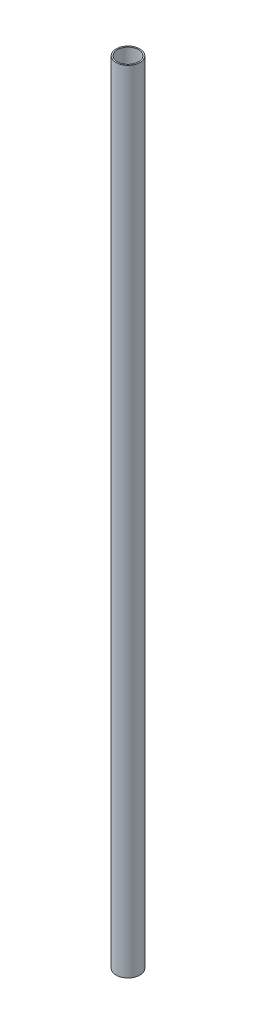
ISO-10303-21;
HEADER;
FILE_DESCRIPTION(('STEP AP214'),'2;1');
FILE_NAME('part.step','',(''),(''),'','','');
FILE_SCHEMA(('AUTOMOTIVE_DESIGN { 1 0 10303 214 1 1 1 1 }'));
ENDSEC;
DATA;
#1=APPLICATION_CONTEXT('core data for automotive mechanical design processes');
#2=APPLICATION_PROTOCOL_DEFINITION('international standard','automotive_design',2000,#1);
#3=PRODUCT_CONTEXT('',#1,'mechanical');
#4=PRODUCT('Part','Part','',(#3));
#5=PRODUCT_RELATED_PRODUCT_CATEGORY('part','',(#4));
#6=PRODUCT_DEFINITION_FORMATION('','',#4);
#7=PRODUCT_DEFINITION_CONTEXT('part definition',#1,'design');
#8=PRODUCT_DEFINITION('design','',#6,#7);
#9=PRODUCT_DEFINITION_SHAPE('','',#8);
#10=(LENGTH_UNIT() NAMED_UNIT(*) SI_UNIT(.MILLI.,.METRE.));
#11=(NAMED_UNIT(*) PLANE_ANGLE_UNIT() SI_UNIT($,.RADIAN.));
#12=(NAMED_UNIT(*) SI_UNIT($,.STERADIAN.) SOLID_ANGLE_UNIT());
#13=UNCERTAINTY_MEASURE_WITH_UNIT(LENGTH_MEASURE(1.E-05),#10,'distance_accuracy_value','');
#14=(GEOMETRIC_REPRESENTATION_CONTEXT(3) GLOBAL_UNCERTAINTY_ASSIGNED_CONTEXT((#13)) GLOBAL_UNIT_ASSIGNED_CONTEXT((#10,
#11,#12)) REPRESENTATION_CONTEXT('',''));
#15=CARTESIAN_POINT('',(0.,0.,0.));
#16=DIRECTION('',(0.,0.,1.));
#17=DIRECTION('',(1.,0.,0.));
#18=AXIS2_PLACEMENT_3D('',#15,#16,#17);
#19=CARTESIAN_POINT('',(0.,527.05,0.));
#20=DIRECTION('',(0.,1.,0.));
#21=DIRECTION('',(0.,0.,1.));
#22=AXIS2_PLACEMENT_3D('',#19,#20,#21);
#23=PLANE('',#22);
#24=CARTESIAN_POINT('',(0.,527.05,0.));
#25=DIRECTION('',(0.,1.,0.));
#26=DIRECTION('',(0.,0.,1.));
#27=AXIS2_PLACEMENT_3D('',#24,#25,#26);
#28=CIRCLE('',#27,7.9375);
#29=CARTESIAN_POINT('',(0.,527.05,7.9375));
#30=VERTEX_POINT('',#29);
#31=EDGE_CURVE('E10',#30,#30,#28,.T.);
#32=ORIENTED_EDGE('',*,*,#31,.T.);
#33=EDGE_LOOP('',(#32));
#34=FACE_BOUND('',#33,.T.);
#35=CARTESIAN_POINT('',(0.,527.05,0.));
#36=DIRECTION('',(0.,1.,0.));
#37=DIRECTION('',(0.,0.,1.));
#38=AXIS2_PLACEMENT_3D('',#35,#36,#37);
#39=CIRCLE('',#38,7.0485);
#40=CARTESIAN_POINT('',(0.,527.05,7.0485));
#41=VERTEX_POINT('',#40);
#42=EDGE_CURVE('E48',#41,#41,#39,.T.);
#43=ORIENTED_EDGE('',*,*,#42,.F.);
#44=EDGE_LOOP('',(#43));
#45=FACE_BOUND('',#44,.T.);
#46=ADVANCED_FACE('F37',(#34,#45),#23,.T.);
#47=CARTESIAN_POINT('',(0.,0.,0.));
#48=DIRECTION('',(0.,1.,0.));
#49=DIRECTION('',(0.,0.,1.));
#50=AXIS2_PLACEMENT_3D('',#47,#48,#49);
#51=PLANE('',#50);
#52=CARTESIAN_POINT('',(0.,0.,0.));
#53=DIRECTION('',(0.,1.,0.));
#54=DIRECTION('',(0.,0.,1.));
#55=AXIS2_PLACEMENT_3D('',#52,#53,#54);
#56=CIRCLE('',#55,7.9375);
#57=CARTESIAN_POINT('',(0.,0.,7.9375));
#58=VERTEX_POINT('',#57);
#59=EDGE_CURVE('E41',#58,#58,#56,.T.);
#60=ORIENTED_EDGE('',*,*,#59,.F.);
#61=EDGE_LOOP('',(#60));
#62=FACE_BOUND('',#61,.T.);
#63=CARTESIAN_POINT('',(0.,0.,0.));
#64=DIRECTION('',(0.,1.,0.));
#65=DIRECTION('',(0.,0.,1.));
#66=AXIS2_PLACEMENT_3D('',#63,#64,#65);
#67=CIRCLE('',#66,7.0485);
#68=CARTESIAN_POINT('',(0.,0.,7.0485));
#69=VERTEX_POINT('',#68);
#70=EDGE_CURVE('E50',#69,#69,#67,.T.);
#71=ORIENTED_EDGE('',*,*,#70,.T.);
#72=EDGE_LOOP('',(#71));
#73=FACE_BOUND('',#72,.T.);
#74=ADVANCED_FACE('F60',(#62,#73),#51,.F.);
#75=CARTESIAN_POINT('',(0.,527.05,0.));
#76=DIRECTION('',(0.,-1.,0.));
#77=DIRECTION('',(0.,0.,-1.));
#78=AXIS2_PLACEMENT_3D('',#75,#76,#77);
#79=CYLINDRICAL_SURFACE('',#78,7.9375);
#80=ORIENTED_EDGE('',*,*,#31,.F.);
#81=EDGE_LOOP('',(#80));
#82=FACE_BOUND('',#81,.T.);
#83=ORIENTED_EDGE('',*,*,#59,.T.);
#84=EDGE_LOOP('',(#83));
#85=FACE_BOUND('',#84,.T.);
#86=ADVANCED_FACE('F39',(#82,#85),#79,.T.);
#87=CARTESIAN_POINT('',(0.,527.05,0.));
#88=DIRECTION('',(0.,-1.,0.));
#89=DIRECTION('',(0.,0.,-1.));
#90=AXIS2_PLACEMENT_3D('',#87,#88,#89);
#91=CYLINDRICAL_SURFACE('',#90,7.0485);
#92=ORIENTED_EDGE('',*,*,#42,.T.);
#93=EDGE_LOOP('',(#92));
#94=FACE_BOUND('',#93,.T.);
#95=ORIENTED_EDGE('',*,*,#70,.F.);
#96=EDGE_LOOP('',(#95));
#97=FACE_BOUND('',#96,.T.);
#98=ADVANCED_FACE('F56',(#94,#97),#91,.F.);
#99=CLOSED_SHELL('',(#46,#74,#86,#98));
#100=MANIFOLD_SOLID_BREP('B2',#99);
#101=ADVANCED_BREP_SHAPE_REPRESENTATION('',(#18,#100),#14);
#102=SHAPE_DEFINITION_REPRESENTATION(#9,#101);
ENDSEC;
END-ISO-10303-21;
